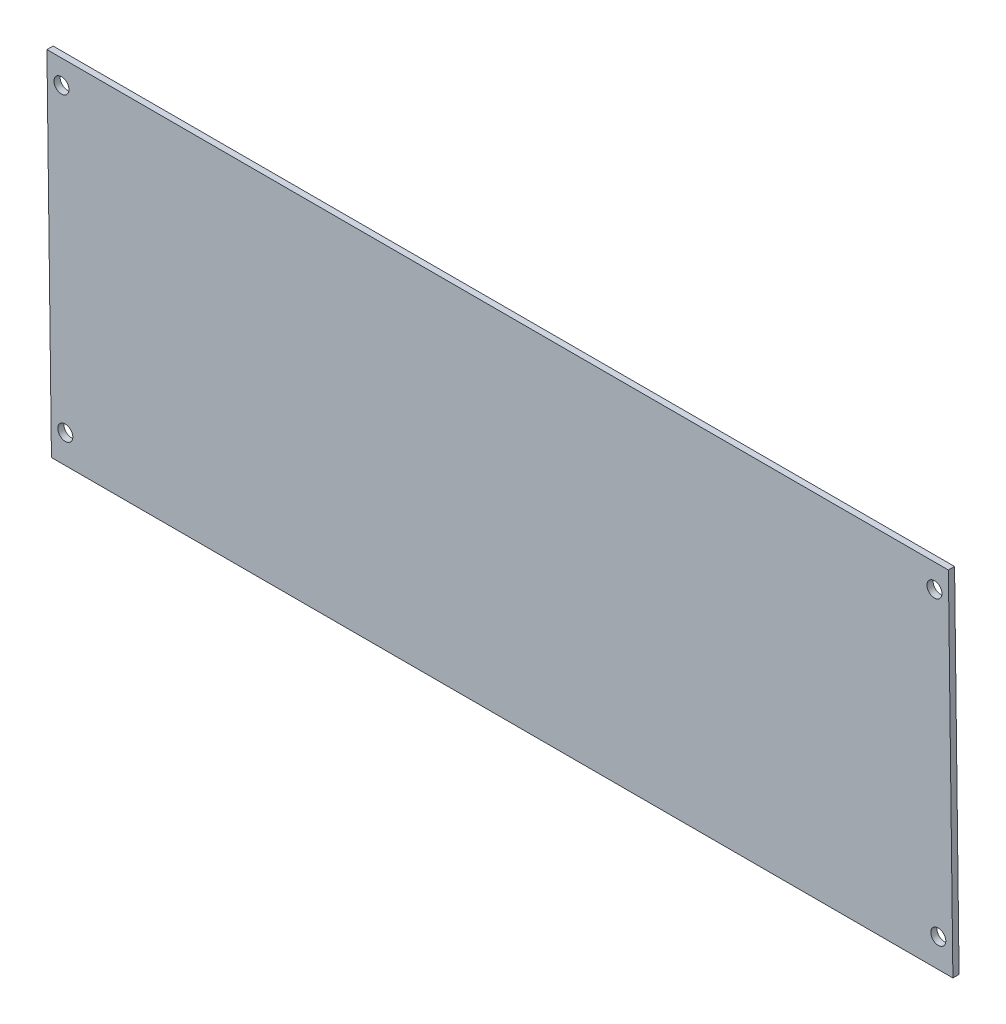
ISO-10303-21;
HEADER;
FILE_DESCRIPTION(('STEP AP214'),'2;1');
FILE_NAME('part.step','',(''),(''),'','','');
FILE_SCHEMA(('AUTOMOTIVE_DESIGN { 1 0 10303 214 1 1 1 1 }'));
ENDSEC;
DATA;
#1=APPLICATION_CONTEXT('core data for automotive mechanical design processes');
#2=APPLICATION_PROTOCOL_DEFINITION('international standard','automotive_design',2000,#1);
#3=PRODUCT_CONTEXT('',#1,'mechanical');
#4=PRODUCT('Part','Part','',(#3));
#5=PRODUCT_RELATED_PRODUCT_CATEGORY('part','',(#4));
#6=PRODUCT_DEFINITION_FORMATION('','',#4);
#7=PRODUCT_DEFINITION_CONTEXT('part definition',#1,'design');
#8=PRODUCT_DEFINITION('design','',#6,#7);
#9=PRODUCT_DEFINITION_SHAPE('','',#8);
#10=(LENGTH_UNIT() NAMED_UNIT(*) SI_UNIT(.MILLI.,.METRE.));
#11=(NAMED_UNIT(*) PLANE_ANGLE_UNIT() SI_UNIT($,.RADIAN.));
#12=(NAMED_UNIT(*) SI_UNIT($,.STERADIAN.) SOLID_ANGLE_UNIT());
#13=UNCERTAINTY_MEASURE_WITH_UNIT(LENGTH_MEASURE(1.E-05),#10,'distance_accuracy_value','');
#14=(GEOMETRIC_REPRESENTATION_CONTEXT(3) GLOBAL_UNCERTAINTY_ASSIGNED_CONTEXT((#13)) GLOBAL_UNIT_ASSIGNED_CONTEXT((#10,
#11,#12)) REPRESENTATION_CONTEXT('',''));
#15=CARTESIAN_POINT('',(0.,0.,0.));
#16=DIRECTION('',(0.,0.,1.));
#17=DIRECTION('',(1.,0.,0.));
#18=AXIS2_PLACEMENT_3D('',#15,#16,#17);
#19=CARTESIAN_POINT('',(190.,32.1214285714286,1.3));
#20=DIRECTION('',(-0.999917827355135,-0.0128194593250658,0.));
#21=DIRECTION('',(0.0128194593250658,-0.999917827355135,0.));
#22=AXIS2_PLACEMENT_3D('',#19,#20,#21);
#23=PLANE('',#22);
#24=DIRECTION('',(0.,0.,1.));
#25=VECTOR('',#24,1.);
#26=CARTESIAN_POINT('',(189.948717948718,36.1214285714286,1.3));
#27=LINE('',#26,#25);
#28=CARTESIAN_POINT('',(189.948717948718,36.1214285714286,0.));
#29=VERTEX_POINT('',#28);
#30=CARTESIAN_POINT('',(189.948717948718,36.1214285714286,1.3));
#31=VERTEX_POINT('',#30);
#32=EDGE_CURVE('E89',#29,#31,#27,.T.);
#33=ORIENTED_EDGE('',*,*,#32,.F.);
#34=DIRECTION('',(-0.0128194593250658,0.999917827355135,0.));
#35=VECTOR('',#34,1.);
#36=CARTESIAN_POINT('',(190.,32.1214285714286,0.));
#37=LINE('',#36,#35);
#38=CARTESIAN_POINT('',(189.000082186134,110.115018052977,0.));
#39=VERTEX_POINT('',#38);
#40=EDGE_CURVE('E60',#29,#39,#37,.T.);
#41=ORIENTED_EDGE('',*,*,#40,.T.);
#42=DIRECTION('',(0.,0.,-1.));
#43=VECTOR('',#42,1.);
#44=CARTESIAN_POINT('',(189.000082186134,110.115018052977,1.3));
#45=LINE('',#44,#43);
#46=CARTESIAN_POINT('',(189.000082186134,110.115018052977,1.3));
#47=VERTEX_POINT('',#46);
#48=EDGE_CURVE('E117',#47,#39,#45,.T.);
#49=ORIENTED_EDGE('',*,*,#48,.F.);
#50=DIRECTION('',(-0.0128194593250658,0.999917827355135,0.));
#51=VECTOR('',#50,1.);
#52=CARTESIAN_POINT('',(190.,32.1214285714286,1.3));
#53=LINE('',#52,#51);
#54=EDGE_CURVE('E101',#31,#47,#53,.T.);
#55=ORIENTED_EDGE('',*,*,#54,.F.);
#56=EDGE_LOOP('',(#33,#41,#49,#55));
#57=FACE_BOUND('',#56,.T.);
#58=ADVANCED_FACE('F38',(#57),#23,.F.);
#59=CARTESIAN_POINT('',(0.,0.,1.3));
#60=DIRECTION('',(0.,0.,-1.));
#61=DIRECTION('',(-1.,0.,0.));
#62=AXIS2_PLACEMENT_3D('',#59,#60,#61);
#63=PLANE('',#62);
#64=CARTESIAN_POINT('',(186.871548333602,42.1214285714286,1.3));
#65=DIRECTION('',(0.,0.,1.));
#66=DIRECTION('',(1.,0.,0.));
#67=AXIS2_PLACEMENT_3D('',#64,#65,#66);
#68=CIRCLE('',#67,1.58499999999999);
#69=CARTESIAN_POINT('',(188.456548333602,42.1214285714286,1.3));
#70=VERTEX_POINT('',#69);
#71=EDGE_CURVE('E120',#70,#70,#68,.T.);
#72=ORIENTED_EDGE('',*,*,#71,.F.);
#73=EDGE_LOOP('',(#72));
#74=FACE_BOUND('',#73,.T.);
#75=CARTESIAN_POINT('',(2.87203092677808,42.1214285714286,1.3));
#76=DIRECTION('',(0.,0.,1.));
#77=DIRECTION('',(1.,0.,0.));
#78=AXIS2_PLACEMENT_3D('',#75,#76,#77);
#79=CIRCLE('',#78,1.585);
#80=CARTESIAN_POINT('',(4.45703092677808,42.1214285714286,1.3));
#81=VERTEX_POINT('',#80);
#82=EDGE_CURVE('E123',#81,#81,#79,.T.);
#83=ORIENTED_EDGE('',*,*,#82,.F.);
#84=EDGE_LOOP('',(#83));
#85=FACE_BOUND('',#84,.T.);
#86=CARTESIAN_POINT('',(2.06435451275601,105.115018052977,1.3));
#87=DIRECTION('',(0.,0.,1.));
#88=DIRECTION('',(1.,0.,0.));
#89=AXIS2_PLACEMENT_3D('',#86,#87,#88);
#90=CIRCLE('',#89,1.58499999999999);
#91=CARTESIAN_POINT('',(3.649354512756,105.115018052977,1.3));
#92=VERTEX_POINT('',#91);
#93=EDGE_CURVE('E128',#92,#92,#90,.T.);
#94=ORIENTED_EDGE('',*,*,#93,.F.);
#95=EDGE_LOOP('',(#94));
#96=FACE_BOUND('',#95,.T.);
#97=CARTESIAN_POINT('',(186.063938212043,105.115018052977,1.3));
#98=DIRECTION('',(0.,0.,1.));
#99=DIRECTION('',(1.,0.,0.));
#100=AXIS2_PLACEMENT_3D('',#97,#98,#99);
#101=CIRCLE('',#100,1.58499999999999);
#102=CARTESIAN_POINT('',(187.648938212043,105.115018052977,1.3));
#103=VERTEX_POINT('',#102);
#104=EDGE_CURVE('E109',#103,#103,#101,.T.);
#105=ORIENTED_EDGE('',*,*,#104,.F.);
#106=EDGE_LOOP('',(#105));
#107=FACE_BOUND('',#106,.T.);
#108=DIRECTION('',(-1.,0.,0.));
#109=VECTOR('',#108,1.);
#110=CARTESIAN_POINT('',(190.,36.1214285714286,1.3));
#111=LINE('',#110,#109);
#112=CARTESIAN_POINT('',(-0.0512862607557013,36.1214285714286,1.3));
#113=VERTEX_POINT('',#112);
#114=EDGE_CURVE('E52',#31,#113,#111,.T.);
#115=ORIENTED_EDGE('',*,*,#114,.F.);
#116=ORIENTED_EDGE('',*,*,#54,.T.);
#117=DIRECTION('',(1.,0.,0.));
#118=VECTOR('',#117,1.);
#119=CARTESIAN_POINT('',(-3.49999989185595,110.115018052977,1.3));
#120=LINE('',#119,#118);
#121=CARTESIAN_POINT('',(-0.999999891855952,110.115018052977,1.3));
#122=VERTEX_POINT('',#121);
#123=EDGE_CURVE('E118',#122,#47,#120,.T.);
#124=ORIENTED_EDGE('',*,*,#123,.F.);
#125=DIRECTION('',(0.0128205114340507,-0.999917813866004,0.));
#126=VECTOR('',#125,1.);
#127=CARTESIAN_POINT('',(0.,32.1214285714286,1.3));
#128=LINE('',#127,#126);
#129=EDGE_CURVE('E95',#122,#113,#128,.T.);
#130=ORIENTED_EDGE('',*,*,#129,.T.);
#131=EDGE_LOOP('',(#115,#116,#124,#130));
#132=FACE_BOUND('',#131,.T.);
#133=ADVANCED_FACE('F135',(#74,#85,#96,#107,#132),#63,.F.);
#134=CARTESIAN_POINT('',(0.,0.,0.));
#135=DIRECTION('',(0.,0.,-1.));
#136=DIRECTION('',(-1.,0.,0.));
#137=AXIS2_PLACEMENT_3D('',#134,#135,#136);
#138=PLANE('',#137);
#139=CARTESIAN_POINT('',(186.871548333602,42.1214285714286,0.));
#140=DIRECTION('',(0.,0.,-1.));
#141=DIRECTION('',(-1.,0.,0.));
#142=AXIS2_PLACEMENT_3D('',#139,#140,#141);
#143=CIRCLE('',#142,1.58499999999999);
#144=CARTESIAN_POINT('',(185.286548333602,42.1214285714286,0.));
#145=VERTEX_POINT('',#144);
#146=EDGE_CURVE('E93',#145,#145,#143,.T.);
#147=ORIENTED_EDGE('',*,*,#146,.F.);
#148=EDGE_LOOP('',(#147));
#149=FACE_BOUND('',#148,.T.);
#150=CARTESIAN_POINT('',(2.87203092677808,42.1214285714286,0.));
#151=DIRECTION('',(0.,0.,-1.));
#152=DIRECTION('',(-1.,0.,0.));
#153=AXIS2_PLACEMENT_3D('',#150,#151,#152);
#154=CIRCLE('',#153,1.585);
#155=CARTESIAN_POINT('',(1.28703092677808,42.1214285714286,0.));
#156=VERTEX_POINT('',#155);
#157=EDGE_CURVE('E98',#156,#156,#154,.T.);
#158=ORIENTED_EDGE('',*,*,#157,.F.);
#159=EDGE_LOOP('',(#158));
#160=FACE_BOUND('',#159,.T.);
#161=CARTESIAN_POINT('',(2.06435451275601,105.115018052977,0.));
#162=DIRECTION('',(0.,0.,-1.));
#163=DIRECTION('',(-1.,0.,0.));
#164=AXIS2_PLACEMENT_3D('',#161,#162,#163);
#165=CIRCLE('',#164,1.58499999999999);
#166=CARTESIAN_POINT('',(0.479354512756016,105.115018052977,0.));
#167=VERTEX_POINT('',#166);
#168=EDGE_CURVE('E108',#167,#167,#165,.T.);
#169=ORIENTED_EDGE('',*,*,#168,.F.);
#170=EDGE_LOOP('',(#169));
#171=FACE_BOUND('',#170,.T.);
#172=CARTESIAN_POINT('',(186.063938212043,105.115018052977,0.));
#173=DIRECTION('',(0.,0.,-1.));
#174=DIRECTION('',(-1.,0.,0.));
#175=AXIS2_PLACEMENT_3D('',#172,#173,#174);
#176=CIRCLE('',#175,1.58499999999999);
#177=CARTESIAN_POINT('',(184.478938212043,105.115018052977,0.));
#178=VERTEX_POINT('',#177);
#179=EDGE_CURVE('E105',#178,#178,#176,.T.);
#180=ORIENTED_EDGE('',*,*,#179,.F.);
#181=EDGE_LOOP('',(#180));
#182=FACE_BOUND('',#181,.T.);
#183=ORIENTED_EDGE('',*,*,#40,.F.);
#184=DIRECTION('',(1.,0.,0.));
#185=VECTOR('',#184,1.);
#186=CARTESIAN_POINT('',(190.,36.1214285714286,0.));
#187=LINE('',#186,#185);
#188=CARTESIAN_POINT('',(-0.0512862607557063,36.1214285714286,0.));
#189=VERTEX_POINT('',#188);
#190=EDGE_CURVE('E79',#189,#29,#187,.T.);
#191=ORIENTED_EDGE('',*,*,#190,.F.);
#192=DIRECTION('',(0.0128205114340507,-0.999917813866004,0.));
#193=VECTOR('',#192,1.);
#194=CARTESIAN_POINT('',(0.,32.1214285714286,0.));
#195=LINE('',#194,#193);
#196=CARTESIAN_POINT('',(-0.999999891855952,110.115018052977,0.));
#197=VERTEX_POINT('',#196);
#198=EDGE_CURVE('E88',#197,#189,#195,.T.);
#199=ORIENTED_EDGE('',*,*,#198,.F.);
#200=DIRECTION('',(1.,0.,0.));
#201=VECTOR('',#200,1.);
#202=CARTESIAN_POINT('',(0.,110.115018052977,0.));
#203=LINE('',#202,#201);
#204=EDGE_CURVE('E46',#197,#39,#203,.T.);
#205=ORIENTED_EDGE('',*,*,#204,.T.);
#206=EDGE_LOOP('',(#183,#191,#199,#205));
#207=FACE_BOUND('',#206,.T.);
#208=ADVANCED_FACE('F86',(#149,#160,#171,#182,#207),#138,.T.);
#209=CARTESIAN_POINT('',(0.,32.1214285714286,1.3));
#210=DIRECTION('',(0.999917813866004,0.0128205114340507,0.));
#211=DIRECTION('',(-0.0128205114340507,0.999917813866004,0.));
#212=AXIS2_PLACEMENT_3D('',#209,#210,#211);
#213=PLANE('',#212);
#214=DIRECTION('',(0.,0.,-1.));
#215=VECTOR('',#214,1.);
#216=CARTESIAN_POINT('',(-0.0512862607557013,36.1214285714286,1.3));
#217=LINE('',#216,#215);
#218=EDGE_CURVE('E11',#113,#189,#217,.T.);
#219=ORIENTED_EDGE('',*,*,#218,.F.);
#220=ORIENTED_EDGE('',*,*,#129,.F.);
#221=DIRECTION('',(0.,0.,-1.));
#222=VECTOR('',#221,1.);
#223=CARTESIAN_POINT('',(-0.999999891855952,110.115018052977,1.3));
#224=LINE('',#223,#222);
#225=EDGE_CURVE('E92',#122,#197,#224,.T.);
#226=ORIENTED_EDGE('',*,*,#225,.T.);
#227=ORIENTED_EDGE('',*,*,#198,.T.);
#228=EDGE_LOOP('',(#219,#220,#226,#227));
#229=FACE_BOUND('',#228,.T.);
#230=ADVANCED_FACE('F40',(#229),#213,.F.);
#231=CARTESIAN_POINT('',(186.063938212043,105.115018052977,-3.7));
#232=DIRECTION('',(0.,0.,1.));
#233=DIRECTION('',(1.,0.,0.));
#234=AXIS2_PLACEMENT_3D('',#231,#232,#233);
#235=CYLINDRICAL_SURFACE('',#234,1.58499999999999);
#236=ORIENTED_EDGE('',*,*,#179,.T.);
#237=EDGE_LOOP('',(#236));
#238=FACE_BOUND('',#237,.T.);
#239=ORIENTED_EDGE('',*,*,#104,.T.);
#240=EDGE_LOOP('',(#239));
#241=FACE_BOUND('',#240,.T.);
#242=ADVANCED_FACE('F147',(#238,#241),#235,.F.);
#243=CARTESIAN_POINT('',(2.06435451275601,105.115018052977,-3.7));
#244=DIRECTION('',(0.,0.,1.));
#245=DIRECTION('',(1.,0.,0.));
#246=AXIS2_PLACEMENT_3D('',#243,#244,#245);
#247=CYLINDRICAL_SURFACE('',#246,1.58499999999999);
#248=ORIENTED_EDGE('',*,*,#168,.T.);
#249=EDGE_LOOP('',(#248));
#250=FACE_BOUND('',#249,.T.);
#251=ORIENTED_EDGE('',*,*,#93,.T.);
#252=EDGE_LOOP('',(#251));
#253=FACE_BOUND('',#252,.T.);
#254=ADVANCED_FACE('F150',(#250,#253),#247,.F.);
#255=CARTESIAN_POINT('',(2.87203092677808,42.1214285714286,-3.7));
#256=DIRECTION('',(0.,0.,1.));
#257=DIRECTION('',(1.,0.,0.));
#258=AXIS2_PLACEMENT_3D('',#255,#256,#257);
#259=CYLINDRICAL_SURFACE('',#258,1.585);
#260=ORIENTED_EDGE('',*,*,#157,.T.);
#261=EDGE_LOOP('',(#260));
#262=FACE_BOUND('',#261,.T.);
#263=ORIENTED_EDGE('',*,*,#82,.T.);
#264=EDGE_LOOP('',(#263));
#265=FACE_BOUND('',#264,.T.);
#266=ADVANCED_FACE('F155',(#262,#265),#259,.F.);
#267=CARTESIAN_POINT('',(186.871548333602,42.1214285714286,-3.7));
#268=DIRECTION('',(0.,0.,1.));
#269=DIRECTION('',(1.,0.,0.));
#270=AXIS2_PLACEMENT_3D('',#267,#268,#269);
#271=CYLINDRICAL_SURFACE('',#270,1.58499999999999);
#272=ORIENTED_EDGE('',*,*,#146,.T.);
#273=EDGE_LOOP('',(#272));
#274=FACE_BOUND('',#273,.T.);
#275=ORIENTED_EDGE('',*,*,#71,.T.);
#276=EDGE_LOOP('',(#275));
#277=FACE_BOUND('',#276,.T.);
#278=ADVANCED_FACE('F152',(#274,#277),#271,.F.);
#279=CARTESIAN_POINT('',(0.,110.115018052977,0.));
#280=DIRECTION('',(0.,1.,0.));
#281=DIRECTION('',(0.,0.,1.));
#282=AXIS2_PLACEMENT_3D('',#279,#280,#281);
#283=PLANE('',#282);
#284=ORIENTED_EDGE('',*,*,#225,.F.);
#285=ORIENTED_EDGE('',*,*,#123,.T.);
#286=ORIENTED_EDGE('',*,*,#48,.T.);
#287=ORIENTED_EDGE('',*,*,#204,.F.);
#288=EDGE_LOOP('',(#284,#285,#286,#287));
#289=FACE_BOUND('',#288,.T.);
#290=ADVANCED_FACE('F114',(#289),#283,.T.);
#291=CARTESIAN_POINT('',(0.,36.1214285714286,0.));
#292=DIRECTION('',(0.,-1.,0.));
#293=DIRECTION('',(0.,0.,-1.));
#294=AXIS2_PLACEMENT_3D('',#291,#292,#293);
#295=PLANE('',#294);
#296=ORIENTED_EDGE('',*,*,#32,.T.);
#297=ORIENTED_EDGE('',*,*,#114,.T.);
#298=ORIENTED_EDGE('',*,*,#218,.T.);
#299=ORIENTED_EDGE('',*,*,#190,.T.);
#300=EDGE_LOOP('',(#296,#297,#298,#299));
#301=FACE_BOUND('',#300,.T.);
#302=ADVANCED_FACE('F78',(#301),#295,.T.);
#303=CLOSED_SHELL('',(#58,#133,#208,#230,#242,#254,#266,#278,#290,#302));
#304=MANIFOLD_SOLID_BREP('B2',#303);
#305=ADVANCED_BREP_SHAPE_REPRESENTATION('',(#18,#304),#14);
#306=SHAPE_DEFINITION_REPRESENTATION(#9,#305);
ENDSEC;
END-ISO-10303-21;
